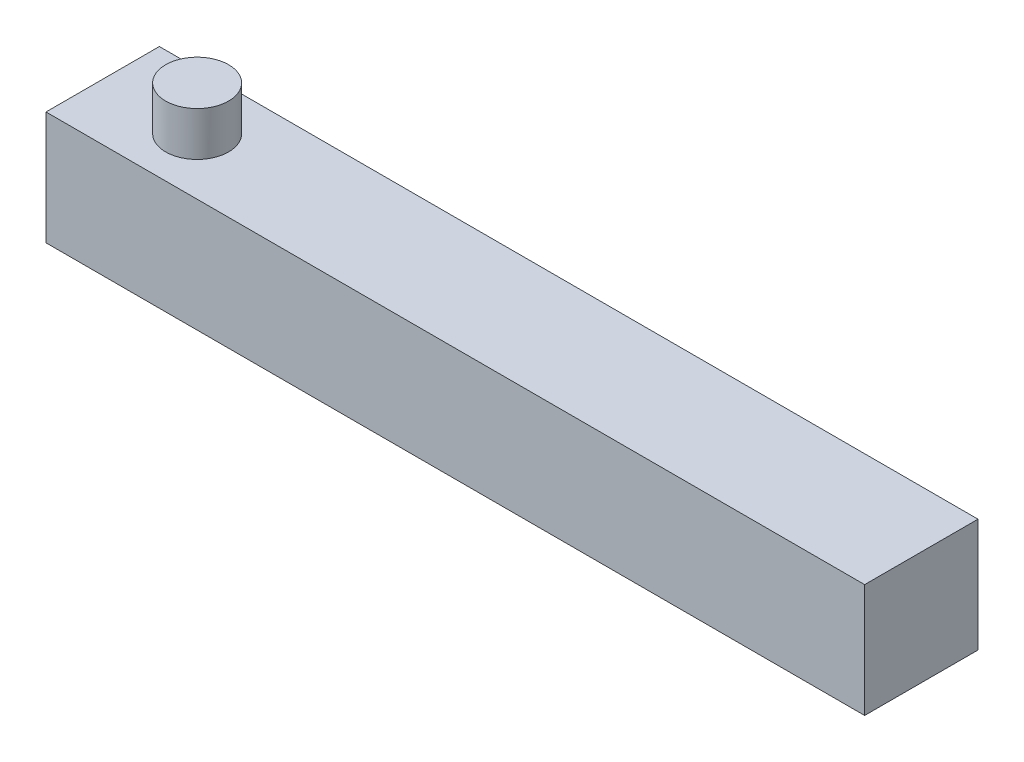
ISO-10303-21;
HEADER;
FILE_DESCRIPTION(('STEP AP214'),'2;1');
FILE_NAME('part.step','',(''),(''),'','','');
FILE_SCHEMA(('AUTOMOTIVE_DESIGN { 1 0 10303 214 1 1 1 1 }'));
ENDSEC;
DATA;
#1=APPLICATION_CONTEXT('core data for automotive mechanical design processes');
#2=APPLICATION_PROTOCOL_DEFINITION('international standard','automotive_design',2000,#1);
#3=PRODUCT_CONTEXT('',#1,'mechanical');
#4=PRODUCT('Part','Part','',(#3));
#5=PRODUCT_RELATED_PRODUCT_CATEGORY('part','',(#4));
#6=PRODUCT_DEFINITION_FORMATION('','',#4);
#7=PRODUCT_DEFINITION_CONTEXT('part definition',#1,'design');
#8=PRODUCT_DEFINITION('design','',#6,#7);
#9=PRODUCT_DEFINITION_SHAPE('','',#8);
#10=(LENGTH_UNIT() NAMED_UNIT(*) SI_UNIT(.MILLI.,.METRE.));
#11=(NAMED_UNIT(*) PLANE_ANGLE_UNIT() SI_UNIT($,.RADIAN.));
#12=(NAMED_UNIT(*) SI_UNIT($,.STERADIAN.) SOLID_ANGLE_UNIT());
#13=UNCERTAINTY_MEASURE_WITH_UNIT(LENGTH_MEASURE(1.E-05),#10,'distance_accuracy_value','');
#14=(GEOMETRIC_REPRESENTATION_CONTEXT(3) GLOBAL_UNCERTAINTY_ASSIGNED_CONTEXT((#13)) GLOBAL_UNIT_ASSIGNED_CONTEXT((#10,
#11,#12)) REPRESENTATION_CONTEXT('',''));
#15=CARTESIAN_POINT('',(0.,0.,0.));
#16=DIRECTION('',(0.,0.,1.));
#17=DIRECTION('',(1.,0.,0.));
#18=AXIS2_PLACEMENT_3D('',#15,#16,#17);
#19=CARTESIAN_POINT('',(-32.5,9.,4.5));
#20=DIRECTION('',(1.,0.,0.));
#21=DIRECTION('',(0.,0.,-1.));
#22=AXIS2_PLACEMENT_3D('',#19,#20,#21);
#23=PLANE('',#22);
#24=DIRECTION('',(0.,0.,1.));
#25=VECTOR('',#24,1.);
#26=CARTESIAN_POINT('',(-32.5,0.,4.5));
#27=LINE('',#26,#25);
#28=CARTESIAN_POINT('',(-32.5,0.,-4.5));
#29=VERTEX_POINT('',#28);
#30=CARTESIAN_POINT('',(-32.5,0.,4.5));
#31=VERTEX_POINT('',#30);
#32=EDGE_CURVE('E100',#29,#31,#27,.T.);
#33=ORIENTED_EDGE('',*,*,#32,.T.);
#34=DIRECTION('',(0.,-1.,0.));
#35=VECTOR('',#34,1.);
#36=CARTESIAN_POINT('',(-32.5,9.,4.5));
#37=LINE('',#36,#35);
#38=CARTESIAN_POINT('',(-32.5,9.,4.5));
#39=VERTEX_POINT('',#38);
#40=EDGE_CURVE('E42',#39,#31,#37,.T.);
#41=ORIENTED_EDGE('',*,*,#40,.F.);
#42=DIRECTION('',(0.,0.,1.));
#43=VECTOR('',#42,1.);
#44=CARTESIAN_POINT('',(-32.5,9.,4.5));
#45=LINE('',#44,#43);
#46=CARTESIAN_POINT('',(-32.5,9.,-4.5));
#47=VERTEX_POINT('',#46);
#48=EDGE_CURVE('E86',#47,#39,#45,.T.);
#49=ORIENTED_EDGE('',*,*,#48,.F.);
#50=DIRECTION('',(0.,-1.,0.));
#51=VECTOR('',#50,1.);
#52=CARTESIAN_POINT('',(-32.5,9.,-4.5));
#53=LINE('',#52,#51);
#54=EDGE_CURVE('E96',#47,#29,#53,.T.);
#55=ORIENTED_EDGE('',*,*,#54,.T.);
#56=EDGE_LOOP('',(#33,#41,#49,#55));
#57=FACE_BOUND('',#56,.T.);
#58=ADVANCED_FACE('F34',(#57),#23,.F.);
#59=CARTESIAN_POINT('',(32.5,9.,4.5));
#60=DIRECTION('',(0.,0.,-1.));
#61=DIRECTION('',(-1.,0.,0.));
#62=AXIS2_PLACEMENT_3D('',#59,#60,#61);
#63=PLANE('',#62);
#64=DIRECTION('',(1.,0.,0.));
#65=VECTOR('',#64,1.);
#66=CARTESIAN_POINT('',(32.5,0.,4.5));
#67=LINE('',#66,#65);
#68=CARTESIAN_POINT('',(32.5,0.,4.5));
#69=VERTEX_POINT('',#68);
#70=EDGE_CURVE('E91',#31,#69,#67,.T.);
#71=ORIENTED_EDGE('',*,*,#70,.T.);
#72=DIRECTION('',(0.,-1.,0.));
#73=VECTOR('',#72,1.);
#74=CARTESIAN_POINT('',(32.5,9.,4.5));
#75=LINE('',#74,#73);
#76=CARTESIAN_POINT('',(32.5,9.,4.5));
#77=VERTEX_POINT('',#76);
#78=EDGE_CURVE('E89',#77,#69,#75,.T.);
#79=ORIENTED_EDGE('',*,*,#78,.F.);
#80=DIRECTION('',(1.,0.,0.));
#81=VECTOR('',#80,1.);
#82=CARTESIAN_POINT('',(32.5,9.,4.5));
#83=LINE('',#82,#81);
#84=EDGE_CURVE('E81',#39,#77,#83,.T.);
#85=ORIENTED_EDGE('',*,*,#84,.F.);
#86=ORIENTED_EDGE('',*,*,#40,.T.);
#87=EDGE_LOOP('',(#71,#79,#85,#86));
#88=FACE_BOUND('',#87,.T.);
#89=ADVANCED_FACE('F90',(#88),#63,.F.);
#90=CARTESIAN_POINT('',(32.5,9.,-4.5));
#91=DIRECTION('',(-1.,0.,0.));
#92=DIRECTION('',(0.,0.,1.));
#93=AXIS2_PLACEMENT_3D('',#90,#91,#92);
#94=PLANE('',#93);
#95=DIRECTION('',(0.,0.,-1.));
#96=VECTOR('',#95,1.);
#97=CARTESIAN_POINT('',(32.5,0.,-4.5));
#98=LINE('',#97,#96);
#99=CARTESIAN_POINT('',(32.5,0.,-4.5));
#100=VERTEX_POINT('',#99);
#101=EDGE_CURVE('E67',#69,#100,#98,.T.);
#102=ORIENTED_EDGE('',*,*,#101,.T.);
#103=DIRECTION('',(0.,-1.,0.));
#104=VECTOR('',#103,1.);
#105=CARTESIAN_POINT('',(32.5,9.,-4.5));
#106=LINE('',#105,#104);
#107=CARTESIAN_POINT('',(32.5,9.,-4.5));
#108=VERTEX_POINT('',#107);
#109=EDGE_CURVE('E92',#108,#100,#106,.T.);
#110=ORIENTED_EDGE('',*,*,#109,.F.);
#111=DIRECTION('',(0.,0.,-1.));
#112=VECTOR('',#111,1.);
#113=CARTESIAN_POINT('',(32.5,9.,-4.5));
#114=LINE('',#113,#112);
#115=EDGE_CURVE('E84',#77,#108,#114,.T.);
#116=ORIENTED_EDGE('',*,*,#115,.F.);
#117=ORIENTED_EDGE('',*,*,#78,.T.);
#118=EDGE_LOOP('',(#102,#110,#116,#117));
#119=FACE_BOUND('',#118,.T.);
#120=ADVANCED_FACE('F94',(#119),#94,.F.);
#121=CARTESIAN_POINT('',(-32.5,9.,-4.5));
#122=DIRECTION('',(0.,0.,1.));
#123=DIRECTION('',(1.,0.,0.));
#124=AXIS2_PLACEMENT_3D('',#121,#122,#123);
#125=PLANE('',#124);
#126=DIRECTION('',(-1.,0.,0.));
#127=VECTOR('',#126,1.);
#128=CARTESIAN_POINT('',(-32.5,0.,-4.5));
#129=LINE('',#128,#127);
#130=EDGE_CURVE('E73',#100,#29,#129,.T.);
#131=ORIENTED_EDGE('',*,*,#130,.T.);
#132=ORIENTED_EDGE('',*,*,#54,.F.);
#133=DIRECTION('',(-1.,0.,0.));
#134=VECTOR('',#133,1.);
#135=CARTESIAN_POINT('',(-32.5,9.,-4.5));
#136=LINE('',#135,#134);
#137=EDGE_CURVE('E50',#108,#47,#136,.T.);
#138=ORIENTED_EDGE('',*,*,#137,.F.);
#139=ORIENTED_EDGE('',*,*,#109,.T.);
#140=EDGE_LOOP('',(#131,#132,#138,#139));
#141=FACE_BOUND('',#140,.T.);
#142=ADVANCED_FACE('F122',(#141),#125,.F.);
#143=CARTESIAN_POINT('',(0.,9.,0.));
#144=DIRECTION('',(0.,-1.,0.));
#145=DIRECTION('',(0.,0.,-1.));
#146=AXIS2_PLACEMENT_3D('',#143,#144,#145);
#147=PLANE('',#146);
#148=CARTESIAN_POINT('',(-25.,9.,0.));
#149=DIRECTION('',(0.,-1.,0.));
#150=DIRECTION('',(0.,0.,-1.));
#151=AXIS2_PLACEMENT_3D('',#148,#149,#150);
#152=CIRCLE('',#151,2.5);
#153=CARTESIAN_POINT('',(-25.,9.,-2.5));
#154=VERTEX_POINT('',#153);
#155=EDGE_CURVE('E11',#154,#154,#152,.F.);
#156=ORIENTED_EDGE('',*,*,#155,.F.);
#157=EDGE_LOOP('',(#156));
#158=FACE_BOUND('',#157,.T.);
#159=ORIENTED_EDGE('',*,*,#48,.T.);
#160=ORIENTED_EDGE('',*,*,#84,.T.);
#161=ORIENTED_EDGE('',*,*,#115,.T.);
#162=ORIENTED_EDGE('',*,*,#137,.T.);
#163=EDGE_LOOP('',(#159,#160,#161,#162));
#164=FACE_BOUND('',#163,.T.);
#165=ADVANCED_FACE('F82',(#158,#164),#147,.F.);
#166=CARTESIAN_POINT('',(0.,0.,0.));
#167=DIRECTION('',(0.,-1.,0.));
#168=DIRECTION('',(0.,0.,-1.));
#169=AXIS2_PLACEMENT_3D('',#166,#167,#168);
#170=PLANE('',#169);
#171=ORIENTED_EDGE('',*,*,#32,.F.);
#172=ORIENTED_EDGE('',*,*,#130,.F.);
#173=ORIENTED_EDGE('',*,*,#101,.F.);
#174=ORIENTED_EDGE('',*,*,#70,.F.);
#175=EDGE_LOOP('',(#171,#172,#173,#174));
#176=FACE_BOUND('',#175,.T.);
#177=ADVANCED_FACE('F111',(#176),#170,.T.);
#178=CARTESIAN_POINT('',(-25.,12.5,0.));
#179=DIRECTION('',(0.,-1.,0.));
#180=DIRECTION('',(0.,0.,-1.));
#181=AXIS2_PLACEMENT_3D('',#178,#179,#180);
#182=CYLINDRICAL_SURFACE('',#181,2.5);
#183=CARTESIAN_POINT('',(-25.,12.5,0.));
#184=DIRECTION('',(0.,1.,0.));
#185=DIRECTION('',(0.,0.,1.));
#186=AXIS2_PLACEMENT_3D('',#183,#184,#185);
#187=CIRCLE('',#186,2.5);
#188=CARTESIAN_POINT('',(-25.,12.5,2.5));
#189=VERTEX_POINT('',#188);
#190=EDGE_CURVE('E103',#189,#189,#187,.T.);
#191=ORIENTED_EDGE('',*,*,#190,.F.);
#192=EDGE_LOOP('',(#191));
#193=FACE_BOUND('',#192,.T.);
#194=ORIENTED_EDGE('',*,*,#155,.T.);
#195=EDGE_LOOP('',(#194));
#196=FACE_BOUND('',#195,.T.);
#197=ADVANCED_FACE('F113',(#193,#196),#182,.T.);
#198=CARTESIAN_POINT('',(0.,12.5,0.));
#199=DIRECTION('',(0.,1.,0.));
#200=DIRECTION('',(0.,0.,1.));
#201=AXIS2_PLACEMENT_3D('',#198,#199,#200);
#202=PLANE('',#201);
#203=ORIENTED_EDGE('',*,*,#190,.T.);
#204=EDGE_LOOP('',(#203));
#205=FACE_BOUND('',#204,.T.);
#206=ADVANCED_FACE('F119',(#205),#202,.T.);
#207=CLOSED_SHELL('',(#58,#89,#120,#142,#165,#177,#197,#206));
#208=MANIFOLD_SOLID_BREP('B2',#207);
#209=ADVANCED_BREP_SHAPE_REPRESENTATION('',(#18,#208),#14);
#210=SHAPE_DEFINITION_REPRESENTATION(#9,#209);
ENDSEC;
END-ISO-10303-21;
